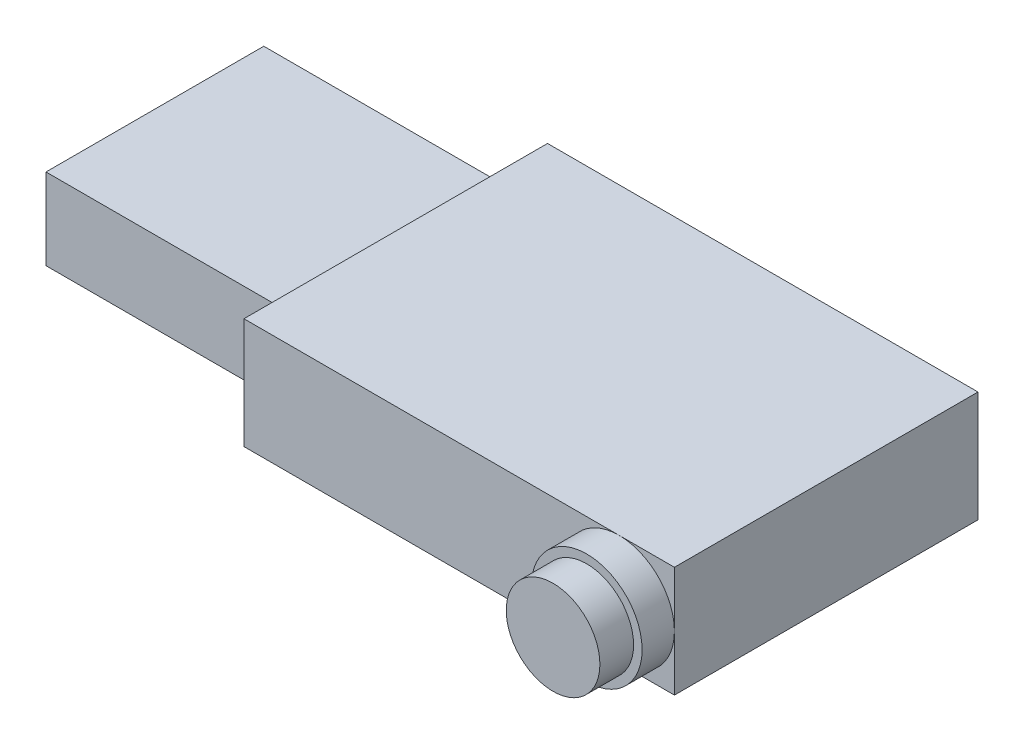
ISO-10303-21;
HEADER;
FILE_DESCRIPTION(('STEP AP214'),'2;1');
FILE_NAME('part.step','',(''),(''),'','','');
FILE_SCHEMA(('AUTOMOTIVE_DESIGN { 1 0 10303 214 1 1 1 1 }'));
ENDSEC;
DATA;
#1=APPLICATION_CONTEXT('core data for automotive mechanical design processes');
#2=APPLICATION_PROTOCOL_DEFINITION('international standard','automotive_design',2000,#1);
#3=PRODUCT_CONTEXT('',#1,'mechanical');
#4=PRODUCT('Part','Part','',(#3));
#5=PRODUCT_RELATED_PRODUCT_CATEGORY('part','',(#4));
#6=PRODUCT_DEFINITION_FORMATION('','',#4);
#7=PRODUCT_DEFINITION_CONTEXT('part definition',#1,'design');
#8=PRODUCT_DEFINITION('design','',#6,#7);
#9=PRODUCT_DEFINITION_SHAPE('','',#8);
#10=(LENGTH_UNIT() NAMED_UNIT(*) SI_UNIT(.MILLI.,.METRE.));
#11=(NAMED_UNIT(*) PLANE_ANGLE_UNIT() SI_UNIT($,.RADIAN.));
#12=(NAMED_UNIT(*) SI_UNIT($,.STERADIAN.) SOLID_ANGLE_UNIT());
#13=UNCERTAINTY_MEASURE_WITH_UNIT(LENGTH_MEASURE(1.E-05),#10,'distance_accuracy_value','');
#14=(GEOMETRIC_REPRESENTATION_CONTEXT(3) GLOBAL_UNCERTAINTY_ASSIGNED_CONTEXT((#13)) GLOBAL_UNIT_ASSIGNED_CONTEXT((#10,
#11,#12)) REPRESENTATION_CONTEXT('',''));
#15=CARTESIAN_POINT('',(0.,0.,0.));
#16=DIRECTION('',(0.,0.,1.));
#17=DIRECTION('',(1.,0.,0.));
#18=AXIS2_PLACEMENT_3D('',#15,#16,#17);
#19=CARTESIAN_POINT('',(20.6502,3.048,1.778));
#20=DIRECTION('',(0.,0.,1.));
#21=DIRECTION('',(1.,0.,0.));
#22=AXIS2_PLACEMENT_3D('',#19,#20,#21);
#23=PLANE('',#22);
#24=CARTESIAN_POINT('',(20.6502,3.048,1.778));
#25=DIRECTION('',(0.,0.,1.));
#26=DIRECTION('',(1.,0.,0.));
#27=AXIS2_PLACEMENT_3D('',#24,#25,#26);
#28=CIRCLE('',#27,3.048);
#29=CARTESIAN_POINT('',(23.6982,3.048,1.778));
#30=VERTEX_POINT('',#29);
#31=EDGE_CURVE('E155',#30,#30,#28,.T.);
#32=ORIENTED_EDGE('',*,*,#31,.T.);
#33=EDGE_LOOP('',(#32));
#34=FACE_BOUND('',#33,.T.);
#35=CARTESIAN_POINT('',(20.6502,3.048,1.778));
#36=DIRECTION('',(0.,0.,1.));
#37=DIRECTION('',(1.,0.,0.));
#38=AXIS2_PLACEMENT_3D('',#35,#36,#37);
#39=CIRCLE('',#38,2.5781);
#40=CARTESIAN_POINT('',(23.2283,3.048,1.778));
#41=VERTEX_POINT('',#40);
#42=EDGE_CURVE('E489',#41,#41,#39,.T.);
#43=ORIENTED_EDGE('',*,*,#42,.F.);
#44=EDGE_LOOP('',(#43));
#45=FACE_BOUND('',#44,.T.);
#46=ADVANCED_FACE('F38',(#34,#45),#23,.T.);
#47=CARTESIAN_POINT('',(0.,6.096,0.));
#48=DIRECTION('',(0.,0.,-1.));
#49=DIRECTION('',(-1.,0.,0.));
#50=AXIS2_PLACEMENT_3D('',#47,#48,#49);
#51=PLANE('',#50);
#52=CARTESIAN_POINT('',(20.6502,3.048,0.));
#53=DIRECTION('',(0.,0.,1.));
#54=DIRECTION('',(1.,0.,0.));
#55=AXIS2_PLACEMENT_3D('',#52,#53,#54);
#56=CIRCLE('',#55,3.048);
#57=CARTESIAN_POINT('',(23.6982,3.048,0.));
#58=VERTEX_POINT('',#57);
#59=CARTESIAN_POINT('',(20.6502,6.096,0.));
#60=VERTEX_POINT('',#59);
#61=EDGE_CURVE('E49',#58,#60,#56,.T.);
#62=ORIENTED_EDGE('',*,*,#61,.F.);
#63=DIRECTION('',(0.,-1.,0.));
#64=VECTOR('',#63,1.);
#65=CARTESIAN_POINT('',(23.6982,6.096,0.));
#66=LINE('',#65,#64);
#67=CARTESIAN_POINT('',(23.6982,6.096,0.));
#68=VERTEX_POINT('',#67);
#69=EDGE_CURVE('E139',#68,#58,#66,.T.);
#70=ORIENTED_EDGE('',*,*,#69,.F.);
#71=DIRECTION('',(1.,0.,0.));
#72=VECTOR('',#71,1.);
#73=CARTESIAN_POINT('',(0.,6.096,0.));
#74=LINE('',#73,#72);
#75=EDGE_CURVE('E152',#60,#68,#74,.T.);
#76=ORIENTED_EDGE('',*,*,#75,.F.);
#77=EDGE_LOOP('',(#62,#70,#76));
#78=FACE_BOUND('',#77,.T.);
#79=ADVANCED_FACE('F151',(#78),#51,.F.);
#80=CARTESIAN_POINT('',(20.6502,0.,0.));
#81=VERTEX_POINT('',#80);
#82=EDGE_CURVE('E11',#60,#81,#56,.T.);
#83=ORIENTED_EDGE('',*,*,#82,.F.);
#84=CARTESIAN_POINT('',(0.,6.096,0.));
#85=VERTEX_POINT('',#84);
#86=EDGE_CURVE('E232',#85,#60,#74,.T.);
#87=ORIENTED_EDGE('',*,*,#86,.F.);
#88=DIRECTION('',(0.,-1.,0.));
#89=VECTOR('',#88,1.);
#90=CARTESIAN_POINT('',(0.,6.096,0.));
#91=LINE('',#90,#89);
#92=CARTESIAN_POINT('',(0.,0.,0.));
#93=VERTEX_POINT('',#92);
#94=EDGE_CURVE('E42',#85,#93,#91,.T.);
#95=ORIENTED_EDGE('',*,*,#94,.T.);
#96=DIRECTION('',(1.,0.,0.));
#97=VECTOR('',#96,1.);
#98=CARTESIAN_POINT('',(0.,0.,0.));
#99=LINE('',#98,#97);
#100=EDGE_CURVE('E240',#93,#81,#99,.T.);
#101=ORIENTED_EDGE('',*,*,#100,.T.);
#102=EDGE_LOOP('',(#83,#87,#95,#101));
#103=FACE_BOUND('',#102,.T.);
#104=ADVANCED_FACE('F262',(#103),#51,.F.);
#105=EDGE_CURVE('E47',#81,#58,#56,.T.);
#106=ORIENTED_EDGE('',*,*,#105,.F.);
#107=CARTESIAN_POINT('',(23.6982,0.,0.));
#108=VERTEX_POINT('',#107);
#109=EDGE_CURVE('E147',#81,#108,#99,.T.);
#110=ORIENTED_EDGE('',*,*,#109,.T.);
#111=EDGE_CURVE('E141',#58,#108,#66,.T.);
#112=ORIENTED_EDGE('',*,*,#111,.F.);
#113=EDGE_LOOP('',(#106,#110,#112));
#114=FACE_BOUND('',#113,.T.);
#115=ADVANCED_FACE('F146',(#114),#51,.F.);
#116=CARTESIAN_POINT('',(0.,6.096,0.));
#117=DIRECTION('',(1.,0.,0.));
#118=DIRECTION('',(0.,0.,-1.));
#119=AXIS2_PLACEMENT_3D('',#116,#117,#118);
#120=PLANE('',#119);
#121=DIRECTION('',(0.,0.,1.));
#122=VECTOR('',#121,1.);
#123=CARTESIAN_POINT('',(0.,0.,0.));
#124=LINE('',#123,#122);
#125=CARTESIAN_POINT('',(0.,0.,-16.7132));
#126=VERTEX_POINT('',#125);
#127=EDGE_CURVE('E227',#126,#93,#124,.T.);
#128=ORIENTED_EDGE('',*,*,#127,.T.);
#129=ORIENTED_EDGE('',*,*,#94,.F.);
#130=DIRECTION('',(0.,0.,1.));
#131=VECTOR('',#130,1.);
#132=CARTESIAN_POINT('',(0.,6.096,0.));
#133=LINE('',#132,#131);
#134=CARTESIAN_POINT('',(0.,6.096,-16.7132));
#135=VERTEX_POINT('',#134);
#136=EDGE_CURVE('E228',#135,#85,#133,.T.);
#137=ORIENTED_EDGE('',*,*,#136,.F.);
#138=DIRECTION('',(0.,-1.,0.));
#139=VECTOR('',#138,1.);
#140=CARTESIAN_POINT('',(0.,6.096,-16.7132));
#141=LINE('',#140,#139);
#142=EDGE_CURVE('E237',#135,#126,#141,.T.);
#143=ORIENTED_EDGE('',*,*,#142,.T.);
#144=EDGE_LOOP('',(#128,#129,#137,#143));
#145=FACE_BOUND('',#144,.T.);
#146=DIRECTION('',(0.,-1.,0.));
#147=VECTOR('',#146,1.);
#148=CARTESIAN_POINT('',(0.,5.2832,-14.351));
#149=LINE('',#148,#147);
#150=CARTESIAN_POINT('',(0.,5.2832,-14.351));
#151=VERTEX_POINT('',#150);
#152=CARTESIAN_POINT('',(0.,0.8128,-14.351));
#153=VERTEX_POINT('',#152);
#154=EDGE_CURVE('E188',#151,#153,#149,.T.);
#155=ORIENTED_EDGE('',*,*,#154,.F.);
#156=DIRECTION('',(0.,0.,-1.));
#157=VECTOR('',#156,1.);
#158=CARTESIAN_POINT('',(0.,5.2832,-14.351));
#159=LINE('',#158,#157);
#160=CARTESIAN_POINT('',(0.,5.2832,-2.3622));
#161=VERTEX_POINT('',#160);
#162=EDGE_CURVE('E199',#161,#151,#159,.T.);
#163=ORIENTED_EDGE('',*,*,#162,.F.);
#164=DIRECTION('',(0.,1.,0.));
#165=VECTOR('',#164,1.);
#166=CARTESIAN_POINT('',(0.,5.2832,-2.3622));
#167=LINE('',#166,#165);
#168=CARTESIAN_POINT('',(0.,0.8128,-2.3622));
#169=VERTEX_POINT('',#168);
#170=EDGE_CURVE('E211',#169,#161,#167,.T.);
#171=ORIENTED_EDGE('',*,*,#170,.F.);
#172=DIRECTION('',(0.,0.,1.));
#173=VECTOR('',#172,1.);
#174=CARTESIAN_POINT('',(0.,0.8128,-14.351));
#175=LINE('',#174,#173);
#176=EDGE_CURVE('E208',#153,#169,#175,.T.);
#177=ORIENTED_EDGE('',*,*,#176,.F.);
#178=EDGE_LOOP('',(#155,#163,#171,#177));
#179=FACE_BOUND('',#178,.T.);
#180=ADVANCED_FACE('F40',(#145,#179),#120,.F.);
#181=CARTESIAN_POINT('',(23.6982,6.096,0.));
#182=DIRECTION('',(-1.,0.,0.));
#183=DIRECTION('',(0.,0.,1.));
#184=AXIS2_PLACEMENT_3D('',#181,#182,#183);
#185=PLANE('',#184);
#186=DIRECTION('',(0.,0.,-1.));
#187=VECTOR('',#186,1.);
#188=CARTESIAN_POINT('',(23.6982,0.,0.));
#189=LINE('',#188,#187);
#190=CARTESIAN_POINT('',(23.6982,0.,-16.7132));
#191=VERTEX_POINT('',#190);
#192=EDGE_CURVE('E242',#108,#191,#189,.T.);
#193=ORIENTED_EDGE('',*,*,#192,.T.);
#194=DIRECTION('',(0.,-1.,0.));
#195=VECTOR('',#194,1.);
#196=CARTESIAN_POINT('',(23.6982,6.096,-16.7132));
#197=LINE('',#196,#195);
#198=CARTESIAN_POINT('',(23.6982,6.096,-16.7132));
#199=VERTEX_POINT('',#198);
#200=EDGE_CURVE('E149',#199,#191,#197,.T.);
#201=ORIENTED_EDGE('',*,*,#200,.F.);
#202=DIRECTION('',(0.,0.,-1.));
#203=VECTOR('',#202,1.);
#204=CARTESIAN_POINT('',(23.6982,6.096,0.));
#205=LINE('',#204,#203);
#206=EDGE_CURVE('E143',#68,#199,#205,.T.);
#207=ORIENTED_EDGE('',*,*,#206,.F.);
#208=ORIENTED_EDGE('',*,*,#69,.T.);
#209=ORIENTED_EDGE('',*,*,#111,.T.);
#210=EDGE_LOOP('',(#193,#201,#207,#208,#209));
#211=FACE_BOUND('',#210,.T.);
#212=ADVANCED_FACE('F140',(#211),#185,.F.);
#213=CARTESIAN_POINT('',(0.,6.096,-16.7132));
#214=DIRECTION('',(0.,0.,1.));
#215=DIRECTION('',(1.,0.,0.));
#216=AXIS2_PLACEMENT_3D('',#213,#214,#215);
#217=PLANE('',#216);
#218=DIRECTION('',(-1.,0.,0.));
#219=VECTOR('',#218,1.);
#220=CARTESIAN_POINT('',(0.,0.,-16.7132));
#221=LINE('',#220,#219);
#222=EDGE_CURVE('E231',#191,#126,#221,.T.);
#223=ORIENTED_EDGE('',*,*,#222,.T.);
#224=ORIENTED_EDGE('',*,*,#142,.F.);
#225=DIRECTION('',(-1.,0.,0.));
#226=VECTOR('',#225,1.);
#227=CARTESIAN_POINT('',(0.,6.096,-16.7132));
#228=LINE('',#227,#226);
#229=EDGE_CURVE('E235',#199,#135,#228,.T.);
#230=ORIENTED_EDGE('',*,*,#229,.F.);
#231=ORIENTED_EDGE('',*,*,#200,.T.);
#232=EDGE_LOOP('',(#223,#224,#230,#231));
#233=FACE_BOUND('',#232,.T.);
#234=ADVANCED_FACE('F251',(#233),#217,.F.);
#235=CARTESIAN_POINT('',(0.,6.096,0.));
#236=DIRECTION('',(0.,-1.,0.));
#237=DIRECTION('',(0.,0.,-1.));
#238=AXIS2_PLACEMENT_3D('',#235,#236,#237);
#239=PLANE('',#238);
#240=ORIENTED_EDGE('',*,*,#136,.T.);
#241=ORIENTED_EDGE('',*,*,#86,.T.);
#242=ORIENTED_EDGE('',*,*,#75,.T.);
#243=ORIENTED_EDGE('',*,*,#206,.T.);
#244=ORIENTED_EDGE('',*,*,#229,.T.);
#245=EDGE_LOOP('',(#240,#241,#242,#243,#244));
#246=FACE_BOUND('',#245,.T.);
#247=ADVANCED_FACE('F261',(#246),#239,.F.);
#248=CARTESIAN_POINT('',(0.,0.,0.));
#249=DIRECTION('',(0.,-1.,0.));
#250=DIRECTION('',(0.,0.,-1.));
#251=AXIS2_PLACEMENT_3D('',#248,#249,#250);
#252=PLANE('',#251);
#253=ORIENTED_EDGE('',*,*,#127,.F.);
#254=ORIENTED_EDGE('',*,*,#222,.F.);
#255=ORIENTED_EDGE('',*,*,#192,.F.);
#256=ORIENTED_EDGE('',*,*,#109,.F.);
#257=ORIENTED_EDGE('',*,*,#100,.F.);
#258=EDGE_LOOP('',(#253,#254,#255,#256,#257));
#259=FACE_BOUND('',#258,.T.);
#260=ADVANCED_FACE('F255',(#259),#252,.T.);
#261=CARTESIAN_POINT('',(-13.2588,5.2832,-14.351));
#262=DIRECTION('',(0.,0.,1.));
#263=DIRECTION('',(1.,0.,0.));
#264=AXIS2_PLACEMENT_3D('',#261,#262,#263);
#265=PLANE('',#264);
#266=ORIENTED_EDGE('',*,*,#154,.T.);
#267=DIRECTION('',(1.,0.,0.));
#268=VECTOR('',#267,1.);
#269=CARTESIAN_POINT('',(-13.2588,0.8128,-14.351));
#270=LINE('',#269,#268);
#271=CARTESIAN_POINT('',(-13.2588,0.8128,-14.351));
#272=VERTEX_POINT('',#271);
#273=EDGE_CURVE('E224',#272,#153,#270,.T.);
#274=ORIENTED_EDGE('',*,*,#273,.F.);
#275=DIRECTION('',(0.,-1.,0.));
#276=VECTOR('',#275,1.);
#277=CARTESIAN_POINT('',(-13.2588,5.2832,-14.351));
#278=LINE('',#277,#276);
#279=CARTESIAN_POINT('',(-13.2588,5.2832,-14.351));
#280=VERTEX_POINT('',#279);
#281=EDGE_CURVE('E195',#280,#272,#278,.T.);
#282=ORIENTED_EDGE('',*,*,#281,.F.);
#283=DIRECTION('',(1.,0.,0.));
#284=VECTOR('',#283,1.);
#285=CARTESIAN_POINT('',(-13.2588,5.2832,-14.351));
#286=LINE('',#285,#284);
#287=EDGE_CURVE('E205',#280,#151,#286,.T.);
#288=ORIENTED_EDGE('',*,*,#287,.T.);
#289=EDGE_LOOP('',(#266,#274,#282,#288));
#290=FACE_BOUND('',#289,.T.);
#291=ADVANCED_FACE('F318',(#290),#265,.F.);
#292=CARTESIAN_POINT('',(-13.2588,0.8128,-14.351));
#293=DIRECTION('',(0.,1.,0.));
#294=DIRECTION('',(0.,0.,1.));
#295=AXIS2_PLACEMENT_3D('',#292,#293,#294);
#296=PLANE('',#295);
#297=ORIENTED_EDGE('',*,*,#176,.T.);
#298=DIRECTION('',(1.,0.,0.));
#299=VECTOR('',#298,1.);
#300=CARTESIAN_POINT('',(-13.2588,0.8128,-2.3622));
#301=LINE('',#300,#299);
#302=CARTESIAN_POINT('',(-13.2588,0.8128,-2.3622));
#303=VERTEX_POINT('',#302);
#304=EDGE_CURVE('E221',#303,#169,#301,.T.);
#305=ORIENTED_EDGE('',*,*,#304,.F.);
#306=DIRECTION('',(0.,0.,1.));
#307=VECTOR('',#306,1.);
#308=CARTESIAN_POINT('',(-13.2588,0.8128,-14.351));
#309=LINE('',#308,#307);
#310=EDGE_CURVE('E198',#272,#303,#309,.T.);
#311=ORIENTED_EDGE('',*,*,#310,.F.);
#312=ORIENTED_EDGE('',*,*,#273,.T.);
#313=EDGE_LOOP('',(#297,#305,#311,#312));
#314=FACE_BOUND('',#313,.T.);
#315=ADVANCED_FACE('F314',(#314),#296,.F.);
#316=CARTESIAN_POINT('',(-13.2588,5.2832,-2.3622));
#317=DIRECTION('',(0.,0.,-1.));
#318=DIRECTION('',(0.,1.,0.));
#319=AXIS2_PLACEMENT_3D('',#316,#317,#318);
#320=PLANE('',#319);
#321=ORIENTED_EDGE('',*,*,#170,.T.);
#322=DIRECTION('',(1.,0.,0.));
#323=VECTOR('',#322,1.);
#324=CARTESIAN_POINT('',(-13.2588,5.2832,-2.3622));
#325=LINE('',#324,#323);
#326=CARTESIAN_POINT('',(-13.2588,5.2832,-2.3622));
#327=VERTEX_POINT('',#326);
#328=EDGE_CURVE('E218',#327,#161,#325,.T.);
#329=ORIENTED_EDGE('',*,*,#328,.F.);
#330=DIRECTION('',(0.,1.,0.));
#331=VECTOR('',#330,1.);
#332=CARTESIAN_POINT('',(-13.2588,5.2832,-2.3622));
#333=LINE('',#332,#331);
#334=EDGE_CURVE('E201',#303,#327,#333,.T.);
#335=ORIENTED_EDGE('',*,*,#334,.F.);
#336=ORIENTED_EDGE('',*,*,#304,.T.);
#337=EDGE_LOOP('',(#321,#329,#335,#336));
#338=FACE_BOUND('',#337,.T.);
#339=ADVANCED_FACE('F310',(#338),#320,.F.);
#340=CARTESIAN_POINT('',(-13.2588,5.2832,-14.351));
#341=DIRECTION('',(0.,-1.,0.));
#342=DIRECTION('',(0.,0.,-1.));
#343=AXIS2_PLACEMENT_3D('',#340,#341,#342);
#344=PLANE('',#343);
#345=ORIENTED_EDGE('',*,*,#162,.T.);
#346=ORIENTED_EDGE('',*,*,#287,.F.);
#347=DIRECTION('',(0.,0.,-1.));
#348=VECTOR('',#347,1.);
#349=CARTESIAN_POINT('',(-13.2588,5.2832,-14.351));
#350=LINE('',#349,#348);
#351=EDGE_CURVE('E203',#327,#280,#350,.T.);
#352=ORIENTED_EDGE('',*,*,#351,.F.);
#353=ORIENTED_EDGE('',*,*,#328,.T.);
#354=EDGE_LOOP('',(#345,#346,#352,#353));
#355=FACE_BOUND('',#354,.T.);
#356=ADVANCED_FACE('F306',(#355),#344,.F.);
#357=CARTESIAN_POINT('',(-13.2588,0.,0.));
#358=DIRECTION('',(-1.,0.,0.));
#359=DIRECTION('',(0.,0.,1.));
#360=AXIS2_PLACEMENT_3D('',#357,#358,#359);
#361=PLANE('',#360);
#362=DIRECTION('',(0.,-1.,0.));
#363=VECTOR('',#362,1.);
#364=CARTESIAN_POINT('',(-13.2588,3.175,-14.0462));
#365=LINE('',#364,#363);
#366=CARTESIAN_POINT('',(-13.2588,3.175,-14.0462));
#367=VERTEX_POINT('',#366);
#368=CARTESIAN_POINT('',(-13.2588,1.1176,-14.0462));
#369=VERTEX_POINT('',#368);
#370=EDGE_CURVE('E176',#367,#369,#365,.T.);
#371=ORIENTED_EDGE('',*,*,#370,.F.);
#372=DIRECTION('',(0.,0.,-1.));
#373=VECTOR('',#372,1.);
#374=CARTESIAN_POINT('',(-13.2588,3.175,-14.0462));
#375=LINE('',#374,#373);
#376=CARTESIAN_POINT('',(-13.2588,3.175,-2.667));
#377=VERTEX_POINT('',#376);
#378=EDGE_CURVE('E166',#377,#367,#375,.T.);
#379=ORIENTED_EDGE('',*,*,#378,.F.);
#380=DIRECTION('',(0.,1.,0.));
#381=VECTOR('',#380,1.);
#382=CARTESIAN_POINT('',(-13.2588,3.175,-2.667));
#383=LINE('',#382,#381);
#384=CARTESIAN_POINT('',(-13.2588,1.1176,-2.667));
#385=VERTEX_POINT('',#384);
#386=EDGE_CURVE('E181',#385,#377,#383,.T.);
#387=ORIENTED_EDGE('',*,*,#386,.F.);
#388=DIRECTION('',(0.,0.,1.));
#389=VECTOR('',#388,1.);
#390=CARTESIAN_POINT('',(-13.2588,1.1176,-14.0462));
#391=LINE('',#390,#389);
#392=EDGE_CURVE('E178',#369,#385,#391,.T.);
#393=ORIENTED_EDGE('',*,*,#392,.F.);
#394=EDGE_LOOP('',(#371,#379,#387,#393));
#395=FACE_BOUND('',#394,.T.);
#396=ORIENTED_EDGE('',*,*,#281,.T.);
#397=ORIENTED_EDGE('',*,*,#310,.T.);
#398=ORIENTED_EDGE('',*,*,#334,.T.);
#399=ORIENTED_EDGE('',*,*,#351,.T.);
#400=EDGE_LOOP('',(#396,#397,#398,#399));
#401=FACE_BOUND('',#400,.T.);
#402=ADVANCED_FACE('F302',(#395,#401),#361,.T.);
#403=CARTESIAN_POINT('',(-4.2418,3.175,-14.0462));
#404=DIRECTION('',(0.,0.,-1.));
#405=DIRECTION('',(-1.,0.,0.));
#406=AXIS2_PLACEMENT_3D('',#403,#404,#405);
#407=PLANE('',#406);
#408=ORIENTED_EDGE('',*,*,#370,.T.);
#409=DIRECTION('',(-1.,0.,0.));
#410=VECTOR('',#409,1.);
#411=CARTESIAN_POINT('',(-4.2418,1.1176,-14.0462));
#412=LINE('',#411,#410);
#413=CARTESIAN_POINT('',(-4.2418,1.1176,-14.0462));
#414=VERTEX_POINT('',#413);
#415=EDGE_CURVE('E175',#414,#369,#412,.T.);
#416=ORIENTED_EDGE('',*,*,#415,.F.);
#417=DIRECTION('',(0.,-1.,0.));
#418=VECTOR('',#417,1.);
#419=CARTESIAN_POINT('',(-4.2418,3.175,-14.0462));
#420=LINE('',#419,#418);
#421=CARTESIAN_POINT('',(-4.2418,3.175,-14.0462));
#422=VERTEX_POINT('',#421);
#423=EDGE_CURVE('E162',#422,#414,#420,.T.);
#424=ORIENTED_EDGE('',*,*,#423,.F.);
#425=DIRECTION('',(-1.,0.,0.));
#426=VECTOR('',#425,1.);
#427=CARTESIAN_POINT('',(-4.2418,3.175,-14.0462));
#428=LINE('',#427,#426);
#429=EDGE_CURVE('E186',#422,#367,#428,.T.);
#430=ORIENTED_EDGE('',*,*,#429,.T.);
#431=EDGE_LOOP('',(#408,#416,#424,#430));
#432=FACE_BOUND('',#431,.T.);
#433=ADVANCED_FACE('F292',(#432),#407,.F.);
#434=CARTESIAN_POINT('',(-4.2418,3.175,-14.0462));
#435=DIRECTION('',(0.,1.,0.));
#436=DIRECTION('',(0.,0.,1.));
#437=AXIS2_PLACEMENT_3D('',#434,#435,#436);
#438=PLANE('',#437);
#439=ORIENTED_EDGE('',*,*,#378,.T.);
#440=ORIENTED_EDGE('',*,*,#429,.F.);
#441=DIRECTION('',(0.,0.,-1.));
#442=VECTOR('',#441,1.);
#443=CARTESIAN_POINT('',(-4.2418,3.175,-14.0462));
#444=LINE('',#443,#442);
#445=CARTESIAN_POINT('',(-4.2418,3.175,-2.667));
#446=VERTEX_POINT('',#445);
#447=EDGE_CURVE('E172',#446,#422,#444,.T.);
#448=ORIENTED_EDGE('',*,*,#447,.F.);
#449=DIRECTION('',(-1.,0.,0.));
#450=VECTOR('',#449,1.);
#451=CARTESIAN_POINT('',(-4.2418,3.175,-2.667));
#452=LINE('',#451,#450);
#453=EDGE_CURVE('E189',#446,#377,#452,.T.);
#454=ORIENTED_EDGE('',*,*,#453,.T.);
#455=EDGE_LOOP('',(#439,#440,#448,#454));
#456=FACE_BOUND('',#455,.T.);
#457=ADVANCED_FACE('F288',(#456),#438,.F.);
#458=CARTESIAN_POINT('',(-4.2418,3.175,-2.667));
#459=DIRECTION('',(0.,0.,1.));
#460=DIRECTION('',(0.,-1.,0.));
#461=AXIS2_PLACEMENT_3D('',#458,#459,#460);
#462=PLANE('',#461);
#463=ORIENTED_EDGE('',*,*,#386,.T.);
#464=ORIENTED_EDGE('',*,*,#453,.F.);
#465=DIRECTION('',(0.,1.,0.));
#466=VECTOR('',#465,1.);
#467=CARTESIAN_POINT('',(-4.2418,3.175,-2.667));
#468=LINE('',#467,#466);
#469=CARTESIAN_POINT('',(-4.2418,1.1176,-2.667));
#470=VERTEX_POINT('',#469);
#471=EDGE_CURVE('E169',#470,#446,#468,.T.);
#472=ORIENTED_EDGE('',*,*,#471,.F.);
#473=DIRECTION('',(-1.,0.,0.));
#474=VECTOR('',#473,1.);
#475=CARTESIAN_POINT('',(-4.2418,1.1176,-2.667));
#476=LINE('',#475,#474);
#477=EDGE_CURVE('E191',#470,#385,#476,.T.);
#478=ORIENTED_EDGE('',*,*,#477,.T.);
#479=EDGE_LOOP('',(#463,#464,#472,#478));
#480=FACE_BOUND('',#479,.T.);
#481=ADVANCED_FACE('F291',(#480),#462,.F.);
#482=CARTESIAN_POINT('',(-4.2418,1.1176,-14.0462));
#483=DIRECTION('',(0.,-1.,0.));
#484=DIRECTION('',(0.,0.,-1.));
#485=AXIS2_PLACEMENT_3D('',#482,#483,#484);
#486=PLANE('',#485);
#487=ORIENTED_EDGE('',*,*,#392,.T.);
#488=ORIENTED_EDGE('',*,*,#477,.F.);
#489=DIRECTION('',(0.,0.,1.));
#490=VECTOR('',#489,1.);
#491=CARTESIAN_POINT('',(-4.2418,1.1176,-14.0462));
#492=LINE('',#491,#490);
#493=EDGE_CURVE('E165',#414,#470,#492,.T.);
#494=ORIENTED_EDGE('',*,*,#493,.F.);
#495=ORIENTED_EDGE('',*,*,#415,.T.);
#496=EDGE_LOOP('',(#487,#488,#494,#495));
#497=FACE_BOUND('',#496,.T.);
#498=ADVANCED_FACE('F286',(#497),#486,.F.);
#499=CARTESIAN_POINT('',(-4.2418,0.,0.));
#500=DIRECTION('',(-1.,0.,0.));
#501=DIRECTION('',(0.,0.,1.));
#502=AXIS2_PLACEMENT_3D('',#499,#500,#501);
#503=PLANE('',#502);
#504=ORIENTED_EDGE('',*,*,#423,.T.);
#505=ORIENTED_EDGE('',*,*,#493,.T.);
#506=ORIENTED_EDGE('',*,*,#471,.T.);
#507=ORIENTED_EDGE('',*,*,#447,.T.);
#508=EDGE_LOOP('',(#504,#505,#506,#507));
#509=FACE_BOUND('',#508,.T.);
#510=ADVANCED_FACE('F282',(#509),#503,.T.);
#511=CARTESIAN_POINT('',(20.6502,3.048,1.778));
#512=DIRECTION('',(0.,0.,-1.));
#513=DIRECTION('',(-1.,0.,0.));
#514=AXIS2_PLACEMENT_3D('',#511,#512,#513);
#515=CYLINDRICAL_SURFACE('',#514,3.048);
#516=ORIENTED_EDGE('',*,*,#31,.F.);
#517=EDGE_LOOP('',(#516));
#518=FACE_BOUND('',#517,.T.);
#519=ORIENTED_EDGE('',*,*,#61,.T.);
#520=ORIENTED_EDGE('',*,*,#82,.T.);
#521=ORIENTED_EDGE('',*,*,#105,.T.);
#522=EDGE_LOOP('',(#519,#520,#521));
#523=FACE_BOUND('',#522,.T.);
#524=ADVANCED_FACE('F157',(#518,#523),#515,.T.);
#525=CARTESIAN_POINT('',(20.6502,3.048,3.6322));
#526=DIRECTION('',(0.,0.,-1.));
#527=DIRECTION('',(-1.,0.,0.));
#528=AXIS2_PLACEMENT_3D('',#525,#526,#527);
#529=CYLINDRICAL_SURFACE('',#528,2.5781);
#530=CARTESIAN_POINT('',(20.6502,3.048,3.6322));
#531=DIRECTION('',(0.,0.,1.));
#532=DIRECTION('',(1.,0.,0.));
#533=AXIS2_PLACEMENT_3D('',#530,#531,#532);
#534=CIRCLE('',#533,2.5781);
#535=CARTESIAN_POINT('',(23.2283,3.048,3.6322));
#536=VERTEX_POINT('',#535);
#537=EDGE_CURVE('E156',#536,#536,#534,.T.);
#538=ORIENTED_EDGE('',*,*,#537,.F.);
#539=EDGE_LOOP('',(#538));
#540=FACE_BOUND('',#539,.T.);
#541=ORIENTED_EDGE('',*,*,#42,.T.);
#542=EDGE_LOOP('',(#541));
#543=FACE_BOUND('',#542,.T.);
#544=ADVANCED_FACE('F278',(#540,#543),#529,.T.);
#545=CARTESIAN_POINT('',(20.6502,3.048,3.6322));
#546=DIRECTION('',(0.,0.,1.));
#547=DIRECTION('',(1.,0.,0.));
#548=AXIS2_PLACEMENT_3D('',#545,#546,#547);
#549=PLANE('',#548);
#550=ORIENTED_EDGE('',*,*,#537,.T.);
#551=EDGE_LOOP('',(#550));
#552=FACE_BOUND('',#551,.T.);
#553=ADVANCED_FACE('F386',(#552),#549,.T.);
#554=CLOSED_SHELL('',(#46,#79,#104,#115,#180,#212,#234,#247,#260,#291,#315,#339,#356,#402,#433,
#457,#481,#498,#510,#524,#544,#553));
#555=MANIFOLD_SOLID_BREP('B2',#554);
#556=ADVANCED_BREP_SHAPE_REPRESENTATION('',(#18,#555),#14);
#557=SHAPE_DEFINITION_REPRESENTATION(#9,#556);
ENDSEC;
END-ISO-10303-21;
